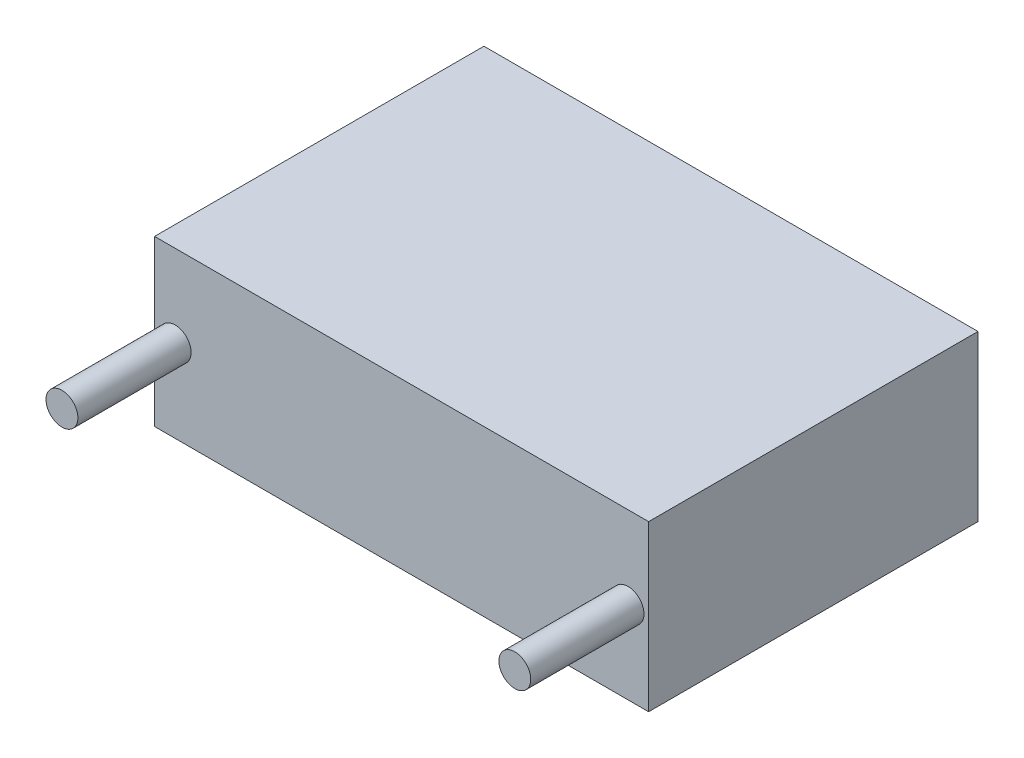
ISO-10303-21;
HEADER;
FILE_DESCRIPTION(('STEP AP214'),'2;1');
FILE_NAME('part.step','',(''),(''),'','','');
FILE_SCHEMA(('AUTOMOTIVE_DESIGN { 1 0 10303 214 1 1 1 1 }'));
ENDSEC;
DATA;
#1=APPLICATION_CONTEXT('core data for automotive mechanical design processes');
#2=APPLICATION_PROTOCOL_DEFINITION('international standard','automotive_design',2000,#1);
#3=PRODUCT_CONTEXT('',#1,'mechanical');
#4=PRODUCT('Part','Part','',(#3));
#5=PRODUCT_RELATED_PRODUCT_CATEGORY('part','',(#4));
#6=PRODUCT_DEFINITION_FORMATION('','',#4);
#7=PRODUCT_DEFINITION_CONTEXT('part definition',#1,'design');
#8=PRODUCT_DEFINITION('design','',#6,#7);
#9=PRODUCT_DEFINITION_SHAPE('','',#8);
#10=(LENGTH_UNIT() NAMED_UNIT(*) SI_UNIT(.MILLI.,.METRE.));
#11=(NAMED_UNIT(*) PLANE_ANGLE_UNIT() SI_UNIT($,.RADIAN.));
#12=(NAMED_UNIT(*) SI_UNIT($,.STERADIAN.) SOLID_ANGLE_UNIT());
#13=UNCERTAINTY_MEASURE_WITH_UNIT(LENGTH_MEASURE(1.E-05),#10,'distance_accuracy_value','');
#14=(GEOMETRIC_REPRESENTATION_CONTEXT(3) GLOBAL_UNCERTAINTY_ASSIGNED_CONTEXT((#13)) GLOBAL_UNIT_ASSIGNED_CONTEXT((#10,
#11,#12)) REPRESENTATION_CONTEXT('',''));
#15=CARTESIAN_POINT('',(0.,0.,0.));
#16=DIRECTION('',(0.,0.,1.));
#17=DIRECTION('',(1.,0.,0.));
#18=AXIS2_PLACEMENT_3D('',#15,#16,#17);
#19=CARTESIAN_POINT('',(0.,8.00000000000001,16.));
#20=DIRECTION('',(0.,0.,-1.));
#21=DIRECTION('',(-0.999999999999998,0.,0.));
#22=AXIS2_PLACEMENT_3D('',#19,#20,#21);
#23=PLANE('',#22);
#24=CARTESIAN_POINT('',(1.,4.,16.));
#25=DIRECTION('',(0.,0.,-1.));
#26=DIRECTION('',(-0.999999999999998,0.,0.));
#27=AXIS2_PLACEMENT_3D('',#24,#25,#26);
#28=CIRCLE('',#27,0.774571480334662);
#29=CARTESIAN_POINT('',(0.22542851966534,4.,16.));
#30=VERTEX_POINT('',#29);
#31=EDGE_CURVE('E36',#30,#30,#28,.F.);
#32=ORIENTED_EDGE('',*,*,#31,.F.);
#33=EDGE_LOOP('',(#32));
#34=FACE_BOUND('',#33,.T.);
#35=DIRECTION('',(0.,-0.999999999999999,0.));
#36=VECTOR('',#35,1.);
#37=CARTESIAN_POINT('',(0.,0.,16.));
#38=LINE('',#37,#36);
#39=CARTESIAN_POINT('',(0.,8.00000000000001,16.));
#40=VERTEX_POINT('',#39);
#41=CARTESIAN_POINT('',(0.,0.,16.));
#42=VERTEX_POINT('',#41);
#43=EDGE_CURVE('E100',#40,#42,#38,.T.);
#44=ORIENTED_EDGE('',*,*,#43,.T.);
#45=DIRECTION('',(0.999999999999998,0.,0.));
#46=VECTOR('',#45,1.);
#47=CARTESIAN_POINT('',(0.,0.,16.));
#48=LINE('',#47,#46);
#49=CARTESIAN_POINT('',(24.,0.,16.));
#50=VERTEX_POINT('',#49);
#51=EDGE_CURVE('E83',#42,#50,#48,.T.);
#52=ORIENTED_EDGE('',*,*,#51,.T.);
#53=DIRECTION('',(0.,0.999999999999999,0.));
#54=VECTOR('',#53,1.);
#55=CARTESIAN_POINT('',(24.,0.,16.));
#56=LINE('',#55,#54);
#57=CARTESIAN_POINT('',(24.,8.00000000000001,16.));
#58=VERTEX_POINT('',#57);
#59=EDGE_CURVE('E48',#50,#58,#56,.T.);
#60=ORIENTED_EDGE('',*,*,#59,.T.);
#61=DIRECTION('',(-0.999999999999998,0.,0.));
#62=VECTOR('',#61,1.);
#63=CARTESIAN_POINT('',(0.,8.00000000000001,16.));
#64=LINE('',#63,#62);
#65=EDGE_CURVE('E43',#58,#40,#64,.T.);
#66=ORIENTED_EDGE('',*,*,#65,.T.);
#67=EDGE_LOOP('',(#44,#52,#60,#66));
#68=FACE_BOUND('',#67,.T.);
#69=CARTESIAN_POINT('',(23.,4.,16.));
#70=DIRECTION('',(0.,0.,-1.));
#71=DIRECTION('',(-0.999999999999998,0.,0.));
#72=AXIS2_PLACEMENT_3D('',#69,#70,#71);
#73=CIRCLE('',#72,0.774571480334662);
#74=CARTESIAN_POINT('',(22.2254285196653,4.,16.));
#75=VERTEX_POINT('',#74);
#76=EDGE_CURVE('E11',#75,#75,#73,.F.);
#77=ORIENTED_EDGE('',*,*,#76,.F.);
#78=EDGE_LOOP('',(#77));
#79=FACE_BOUND('',#78,.T.);
#80=ADVANCED_FACE('F28',(#34,#68,#79),#23,.F.);
#81=CARTESIAN_POINT('',(0.,0.,16.));
#82=DIRECTION('',(0.999999999999998,0.,0.));
#83=DIRECTION('',(0.,0.,-1.));
#84=AXIS2_PLACEMENT_3D('',#81,#82,#83);
#85=PLANE('',#84);
#86=DIRECTION('',(0.,-0.999999999999999,0.));
#87=VECTOR('',#86,1.);
#88=CARTESIAN_POINT('',(0.,0.,0.));
#89=LINE('',#88,#87);
#90=CARTESIAN_POINT('',(0.,8.00000000000001,0.));
#91=VERTEX_POINT('',#90);
#92=CARTESIAN_POINT('',(0.,0.,0.));
#93=VERTEX_POINT('',#92);
#94=EDGE_CURVE('E74',#91,#93,#89,.T.);
#95=ORIENTED_EDGE('',*,*,#94,.T.);
#96=DIRECTION('',(0.,0.,-1.));
#97=VECTOR('',#96,1.);
#98=CARTESIAN_POINT('',(0.,0.,16.));
#99=LINE('',#98,#97);
#100=EDGE_CURVE('E81',#42,#93,#99,.T.);
#101=ORIENTED_EDGE('',*,*,#100,.F.);
#102=ORIENTED_EDGE('',*,*,#43,.F.);
#103=DIRECTION('',(0.,0.,-1.));
#104=VECTOR('',#103,1.);
#105=CARTESIAN_POINT('',(0.,8.00000000000001,16.));
#106=LINE('',#105,#104);
#107=EDGE_CURVE('E89',#40,#91,#106,.T.);
#108=ORIENTED_EDGE('',*,*,#107,.T.);
#109=EDGE_LOOP('',(#95,#101,#102,#108));
#110=FACE_BOUND('',#109,.T.);
#111=ADVANCED_FACE('F30',(#110),#85,.F.);
#112=CARTESIAN_POINT('',(0.,0.,16.));
#113=DIRECTION('',(0.,0.999999999999999,0.));
#114=DIRECTION('',(0.,0.,1.));
#115=AXIS2_PLACEMENT_3D('',#112,#113,#114);
#116=PLANE('',#115);
#117=DIRECTION('',(0.999999999999998,0.,0.));
#118=VECTOR('',#117,1.);
#119=CARTESIAN_POINT('',(0.,0.,0.));
#120=LINE('',#119,#118);
#121=CARTESIAN_POINT('',(24.,0.,0.));
#122=VERTEX_POINT('',#121);
#123=EDGE_CURVE('E69',#93,#122,#120,.T.);
#124=ORIENTED_EDGE('',*,*,#123,.T.);
#125=DIRECTION('',(0.,0.,-1.));
#126=VECTOR('',#125,1.);
#127=CARTESIAN_POINT('',(24.,0.,16.));
#128=LINE('',#127,#126);
#129=EDGE_CURVE('E86',#50,#122,#128,.T.);
#130=ORIENTED_EDGE('',*,*,#129,.F.);
#131=ORIENTED_EDGE('',*,*,#51,.F.);
#132=ORIENTED_EDGE('',*,*,#100,.T.);
#133=EDGE_LOOP('',(#124,#130,#131,#132));
#134=FACE_BOUND('',#133,.T.);
#135=ADVANCED_FACE('F82',(#134),#116,.F.);
#136=CARTESIAN_POINT('',(24.,0.,16.));
#137=DIRECTION('',(-0.999999999999998,0.,0.));
#138=DIRECTION('',(0.,0.,1.));
#139=AXIS2_PLACEMENT_3D('',#136,#137,#138);
#140=PLANE('',#139);
#141=DIRECTION('',(0.,0.999999999999999,0.));
#142=VECTOR('',#141,1.);
#143=CARTESIAN_POINT('',(24.,0.,0.));
#144=LINE('',#143,#142);
#145=CARTESIAN_POINT('',(24.,8.00000000000001,0.));
#146=VERTEX_POINT('',#145);
#147=EDGE_CURVE('E75',#122,#146,#144,.T.);
#148=ORIENTED_EDGE('',*,*,#147,.T.);
#149=DIRECTION('',(0.,0.,-1.));
#150=VECTOR('',#149,1.);
#151=CARTESIAN_POINT('',(24.,8.00000000000001,16.));
#152=LINE('',#151,#150);
#153=EDGE_CURVE('E106',#58,#146,#152,.T.);
#154=ORIENTED_EDGE('',*,*,#153,.F.);
#155=ORIENTED_EDGE('',*,*,#59,.F.);
#156=ORIENTED_EDGE('',*,*,#129,.T.);
#157=EDGE_LOOP('',(#148,#154,#155,#156));
#158=FACE_BOUND('',#157,.T.);
#159=ADVANCED_FACE('F143',(#158),#140,.F.);
#160=CARTESIAN_POINT('',(0.,8.00000000000001,16.));
#161=DIRECTION('',(0.,-0.999999999999999,0.));
#162=DIRECTION('',(0.,0.,-1.));
#163=AXIS2_PLACEMENT_3D('',#160,#161,#162);
#164=PLANE('',#163);
#165=DIRECTION('',(-0.999999999999998,0.,0.));
#166=VECTOR('',#165,1.);
#167=CARTESIAN_POINT('',(0.,8.00000000000001,0.));
#168=LINE('',#167,#166);
#169=EDGE_CURVE('E98',#146,#91,#168,.T.);
#170=ORIENTED_EDGE('',*,*,#169,.T.);
#171=ORIENTED_EDGE('',*,*,#107,.F.);
#172=ORIENTED_EDGE('',*,*,#65,.F.);
#173=ORIENTED_EDGE('',*,*,#153,.T.);
#174=EDGE_LOOP('',(#170,#171,#172,#173));
#175=FACE_BOUND('',#174,.T.);
#176=ADVANCED_FACE('F139',(#175),#164,.F.);
#177=CARTESIAN_POINT('',(0.,8.00000000000001,0.));
#178=DIRECTION('',(0.,0.,-1.));
#179=DIRECTION('',(-0.999999999999998,0.,0.));
#180=AXIS2_PLACEMENT_3D('',#177,#178,#179);
#181=PLANE('',#180);
#182=ORIENTED_EDGE('',*,*,#94,.F.);
#183=ORIENTED_EDGE('',*,*,#169,.F.);
#184=ORIENTED_EDGE('',*,*,#147,.F.);
#185=ORIENTED_EDGE('',*,*,#123,.F.);
#186=EDGE_LOOP('',(#182,#183,#184,#185));
#187=FACE_BOUND('',#186,.T.);
#188=ADVANCED_FACE('F71',(#187),#181,.T.);
#189=CARTESIAN_POINT('',(1.,4.,21.5));
#190=DIRECTION('',(0.,0.,-1.));
#191=DIRECTION('',(-0.999999999999998,0.,0.));
#192=AXIS2_PLACEMENT_3D('',#189,#190,#191);
#193=CYLINDRICAL_SURFACE('',#192,0.774571480334662);
#194=CARTESIAN_POINT('',(1.,4.,21.5));
#195=DIRECTION('',(0.,0.,1.));
#196=DIRECTION('',(0.999999999999998,0.,0.));
#197=AXIS2_PLACEMENT_3D('',#194,#195,#196);
#198=CIRCLE('',#197,0.774571480334662);
#199=CARTESIAN_POINT('',(0.22542851966534,4.,21.5));
#200=VERTEX_POINT('',#199);
#201=EDGE_CURVE('E90',#200,#200,#198,.T.);
#202=CARTESIAN_POINT('',(0.22542851966534,4.,21.5));
#203=CARTESIAN_POINT('',(0.22542851966534,4.,21.4427083333333));
#204=CARTESIAN_POINT('',(0.22542851966534,4.,21.3854166666667));
#205=CARTESIAN_POINT('',(0.22542851966534,4.,21.2708333333333));
#206=CARTESIAN_POINT('',(0.22542851966534,4.,21.2135416666667));
#207=CARTESIAN_POINT('',(0.22542851966534,4.,21.0989583333333));
#208=CARTESIAN_POINT('',(0.22542851966534,4.,21.0416666666667));
#209=CARTESIAN_POINT('',(0.22542851966534,4.,20.9270833333333));
#210=CARTESIAN_POINT('',(0.22542851966534,4.,20.8697916666667));
#211=CARTESIAN_POINT('',(0.22542851966534,4.,20.7552083333333));
#212=CARTESIAN_POINT('',(0.22542851966534,4.,20.6979166666667));
#213=CARTESIAN_POINT('',(0.22542851966534,4.,20.5833333333333));
#214=CARTESIAN_POINT('',(0.22542851966534,4.,20.5260416666667));
#215=CARTESIAN_POINT('',(0.22542851966534,4.,20.4114583333333));
#216=CARTESIAN_POINT('',(0.22542851966534,4.,20.3541666666667));
#217=CARTESIAN_POINT('',(0.22542851966534,4.,20.2395833333333));
#218=CARTESIAN_POINT('',(0.22542851966534,4.,20.1822916666667));
#219=CARTESIAN_POINT('',(0.22542851966534,4.,20.0677083333333));
#220=CARTESIAN_POINT('',(0.22542851966534,4.,20.0104166666667));
#221=CARTESIAN_POINT('',(0.22542851966534,4.,19.8958333333333));
#222=CARTESIAN_POINT('',(0.22542851966534,4.,19.8385416666667));
#223=CARTESIAN_POINT('',(0.22542851966534,4.,19.7239583333333));
#224=CARTESIAN_POINT('',(0.22542851966534,4.,19.6666666666667));
#225=CARTESIAN_POINT('',(0.22542851966534,4.,19.5520833333333));
#226=CARTESIAN_POINT('',(0.22542851966534,4.,19.4947916666667));
#227=CARTESIAN_POINT('',(0.22542851966534,4.,19.3802083333333));
#228=CARTESIAN_POINT('',(0.22542851966534,4.,19.3229166666667));
#229=CARTESIAN_POINT('',(0.22542851966534,4.,19.2083333333333));
#230=CARTESIAN_POINT('',(0.22542851966534,4.,19.1510416666667));
#231=CARTESIAN_POINT('',(0.22542851966534,4.,19.0364583333333));
#232=CARTESIAN_POINT('',(0.22542851966534,4.,18.9791666666667));
#233=CARTESIAN_POINT('',(0.22542851966534,4.,18.8645833333333));
#234=CARTESIAN_POINT('',(0.22542851966534,4.,18.8072916666667));
#235=CARTESIAN_POINT('',(0.22542851966534,4.,18.6927083333333));
#236=CARTESIAN_POINT('',(0.22542851966534,4.,18.6354166666667));
#237=CARTESIAN_POINT('',(0.22542851966534,4.,18.5208333333333));
#238=CARTESIAN_POINT('',(0.22542851966534,4.,18.4635416666667));
#239=CARTESIAN_POINT('',(0.22542851966534,4.,18.3489583333333));
#240=CARTESIAN_POINT('',(0.22542851966534,4.,18.2916666666667));
#241=CARTESIAN_POINT('',(0.22542851966534,4.,18.1770833333333));
#242=CARTESIAN_POINT('',(0.22542851966534,4.,18.1197916666667));
#243=CARTESIAN_POINT('',(0.22542851966534,4.,18.0052083333333));
#244=CARTESIAN_POINT('',(0.22542851966534,4.,17.9479166666667));
#245=CARTESIAN_POINT('',(0.22542851966534,4.,17.8333333333333));
#246=CARTESIAN_POINT('',(0.22542851966534,4.,17.7760416666667));
#247=CARTESIAN_POINT('',(0.22542851966534,4.,17.6614583333333));
#248=CARTESIAN_POINT('',(0.22542851966534,4.,17.6041666666667));
#249=CARTESIAN_POINT('',(0.22542851966534,4.,17.4895833333333));
#250=CARTESIAN_POINT('',(0.22542851966534,4.,17.4322916666667));
#251=CARTESIAN_POINT('',(0.22542851966534,4.,17.3177083333333));
#252=CARTESIAN_POINT('',(0.22542851966534,4.,17.2604166666667));
#253=CARTESIAN_POINT('',(0.22542851966534,4.,17.1458333333333));
#254=CARTESIAN_POINT('',(0.22542851966534,4.,17.0885416666667));
#255=CARTESIAN_POINT('',(0.22542851966534,4.,16.9739583333333));
#256=CARTESIAN_POINT('',(0.22542851966534,4.,16.9166666666667));
#257=CARTESIAN_POINT('',(0.22542851966534,4.,16.8020833333333));
#258=CARTESIAN_POINT('',(0.22542851966534,4.,16.7447916666667));
#259=CARTESIAN_POINT('',(0.22542851966534,4.,16.6302083333333));
#260=CARTESIAN_POINT('',(0.22542851966534,4.,16.5729166666667));
#261=CARTESIAN_POINT('',(0.22542851966534,4.,16.4583333333333));
#262=CARTESIAN_POINT('',(0.22542851966534,4.,16.4010416666667));
#263=CARTESIAN_POINT('',(0.22542851966534,4.,16.2864583333333));
#264=CARTESIAN_POINT('',(0.22542851966534,4.,16.2291666666667));
#265=CARTESIAN_POINT('',(0.22542851966534,4.,16.1145833333333));
#266=CARTESIAN_POINT('',(0.22542851966534,4.,16.0572916666667));
#267=CARTESIAN_POINT('',(0.22542851966534,4.,16.));
#268=B_SPLINE_CURVE_WITH_KNOTS('',3,(#202,#203,#204,#205,#206,#207,#208,#209,#210,#211,#212,
#213,#214,#215,#216,#217,#218,#219,#220,#221,#222,#223,#224,#225,#226,#227,#228,#229,#230,#231,
#232,#233,#234,#235,#236,#237,#238,#239,#240,#241,#242,#243,#244,#245,#246,#247,#248,#249,#250,
#251,#252,#253,#254,#255,#256,#257,#258,#259,#260,#261,#262,#263,#264,#265,#266,#267),
.UNSPECIFIED.,.F.,.F.,(4,2,2,2,2,2,2,2,2,2,2,2,2,2,2,2,2,2,2,2,2,2,2,2,2,2,2,2,2,2,2,2,4),(0.,
0.171875000000002,0.34375,0.515625000000002,0.687500000000001,0.859374999999999,1.03125,
1.203125,1.375,1.546875,1.71875,1.890625,2.0625,2.234375,2.40625,2.578125,2.75,2.921875,3.09375,
3.265625,3.4375,3.609375,3.78125,3.95312499999999,4.125,4.296875,4.46875,4.640625,4.8125,
4.984375,5.15624999999999,5.328125,5.49999999999999),.UNSPECIFIED.);
#269=EDGE_CURVE('BSEAM112',#200,#30,#268,.T.);
#270=ORIENTED_EDGE('',*,*,#201,.F.);
#271=ORIENTED_EDGE('',*,*,#31,.T.);
#272=ORIENTED_EDGE('',*,*,#269,.T.);
#273=ORIENTED_EDGE('',*,*,#269,.F.);
#274=EDGE_LOOP('',(#270,#272,#271,#273));
#275=FACE_BOUND('',#274,.T.);
#276=ADVANCED_FACE('F112',(#275),#193,.T.);
#277=CARTESIAN_POINT('',(1.,4.,21.5));
#278=DIRECTION('',(0.,0.,1.));
#279=DIRECTION('',(0.999999999999998,0.,0.));
#280=AXIS2_PLACEMENT_3D('',#277,#278,#279);
#281=PLANE('',#280);
#282=ORIENTED_EDGE('',*,*,#201,.T.);
#283=EDGE_LOOP('',(#282));
#284=FACE_BOUND('',#283,.T.);
#285=ADVANCED_FACE('F122',(#284),#281,.T.);
#286=CARTESIAN_POINT('',(23.,4.,21.5));
#287=DIRECTION('',(0.,0.,-1.));
#288=DIRECTION('',(-0.999999999999998,0.,0.));
#289=AXIS2_PLACEMENT_3D('',#286,#287,#288);
#290=CYLINDRICAL_SURFACE('',#289,0.774571480334662);
#291=CARTESIAN_POINT('',(23.,4.,21.5));
#292=DIRECTION('',(0.,0.,1.));
#293=DIRECTION('',(0.999999999999998,0.,0.));
#294=AXIS2_PLACEMENT_3D('',#291,#292,#293);
#295=CIRCLE('',#294,0.774571480334662);
#296=CARTESIAN_POINT('',(22.2254285196653,4.,21.5));
#297=VERTEX_POINT('',#296);
#298=EDGE_CURVE('E93',#297,#297,#295,.T.);
#299=CARTESIAN_POINT('',(22.2254285196653,4.,21.5));
#300=CARTESIAN_POINT('',(22.2254285196653,4.,21.4427083333333));
#301=CARTESIAN_POINT('',(22.2254285196653,4.,21.3854166666667));
#302=CARTESIAN_POINT('',(22.2254285196653,4.,21.2708333333333));
#303=CARTESIAN_POINT('',(22.2254285196653,4.,21.2135416666667));
#304=CARTESIAN_POINT('',(22.2254285196653,4.,21.0989583333333));
#305=CARTESIAN_POINT('',(22.2254285196653,4.,21.0416666666667));
#306=CARTESIAN_POINT('',(22.2254285196653,4.,20.9270833333333));
#307=CARTESIAN_POINT('',(22.2254285196653,4.,20.8697916666667));
#308=CARTESIAN_POINT('',(22.2254285196653,4.,20.7552083333333));
#309=CARTESIAN_POINT('',(22.2254285196653,4.,20.6979166666667));
#310=CARTESIAN_POINT('',(22.2254285196653,4.,20.5833333333333));
#311=CARTESIAN_POINT('',(22.2254285196653,4.,20.5260416666667));
#312=CARTESIAN_POINT('',(22.2254285196653,4.,20.4114583333333));
#313=CARTESIAN_POINT('',(22.2254285196653,4.,20.3541666666667));
#314=CARTESIAN_POINT('',(22.2254285196653,4.,20.2395833333333));
#315=CARTESIAN_POINT('',(22.2254285196653,4.,20.1822916666667));
#316=CARTESIAN_POINT('',(22.2254285196653,4.,20.0677083333333));
#317=CARTESIAN_POINT('',(22.2254285196653,4.,20.0104166666667));
#318=CARTESIAN_POINT('',(22.2254285196653,4.,19.8958333333333));
#319=CARTESIAN_POINT('',(22.2254285196653,4.,19.8385416666667));
#320=CARTESIAN_POINT('',(22.2254285196653,4.,19.7239583333333));
#321=CARTESIAN_POINT('',(22.2254285196653,4.,19.6666666666667));
#322=CARTESIAN_POINT('',(22.2254285196653,4.,19.5520833333333));
#323=CARTESIAN_POINT('',(22.2254285196653,4.,19.4947916666667));
#324=CARTESIAN_POINT('',(22.2254285196653,4.,19.3802083333333));
#325=CARTESIAN_POINT('',(22.2254285196653,4.,19.3229166666667));
#326=CARTESIAN_POINT('',(22.2254285196653,4.,19.2083333333333));
#327=CARTESIAN_POINT('',(22.2254285196653,4.,19.1510416666667));
#328=CARTESIAN_POINT('',(22.2254285196653,4.,19.0364583333333));
#329=CARTESIAN_POINT('',(22.2254285196653,4.,18.9791666666667));
#330=CARTESIAN_POINT('',(22.2254285196653,4.,18.8645833333333));
#331=CARTESIAN_POINT('',(22.2254285196653,4.,18.8072916666667));
#332=CARTESIAN_POINT('',(22.2254285196653,4.,18.6927083333333));
#333=CARTESIAN_POINT('',(22.2254285196653,4.,18.6354166666667));
#334=CARTESIAN_POINT('',(22.2254285196653,4.,18.5208333333333));
#335=CARTESIAN_POINT('',(22.2254285196653,4.,18.4635416666667));
#336=CARTESIAN_POINT('',(22.2254285196653,4.,18.3489583333333));
#337=CARTESIAN_POINT('',(22.2254285196653,4.,18.2916666666667));
#338=CARTESIAN_POINT('',(22.2254285196653,4.,18.1770833333333));
#339=CARTESIAN_POINT('',(22.2254285196653,4.,18.1197916666667));
#340=CARTESIAN_POINT('',(22.2254285196653,4.,18.0052083333333));
#341=CARTESIAN_POINT('',(22.2254285196653,4.,17.9479166666667));
#342=CARTESIAN_POINT('',(22.2254285196653,4.,17.8333333333333));
#343=CARTESIAN_POINT('',(22.2254285196653,4.,17.7760416666667));
#344=CARTESIAN_POINT('',(22.2254285196653,4.,17.6614583333333));
#345=CARTESIAN_POINT('',(22.2254285196653,4.,17.6041666666667));
#346=CARTESIAN_POINT('',(22.2254285196653,4.,17.4895833333333));
#347=CARTESIAN_POINT('',(22.2254285196653,4.,17.4322916666667));
#348=CARTESIAN_POINT('',(22.2254285196653,4.,17.3177083333333));
#349=CARTESIAN_POINT('',(22.2254285196653,4.,17.2604166666667));
#350=CARTESIAN_POINT('',(22.2254285196653,4.,17.1458333333333));
#351=CARTESIAN_POINT('',(22.2254285196653,4.,17.0885416666667));
#352=CARTESIAN_POINT('',(22.2254285196653,4.,16.9739583333333));
#353=CARTESIAN_POINT('',(22.2254285196653,4.,16.9166666666667));
#354=CARTESIAN_POINT('',(22.2254285196653,4.,16.8020833333333));
#355=CARTESIAN_POINT('',(22.2254285196653,4.,16.7447916666667));
#356=CARTESIAN_POINT('',(22.2254285196653,4.,16.6302083333333));
#357=CARTESIAN_POINT('',(22.2254285196653,4.,16.5729166666667));
#358=CARTESIAN_POINT('',(22.2254285196653,4.,16.4583333333333));
#359=CARTESIAN_POINT('',(22.2254285196653,4.,16.4010416666667));
#360=CARTESIAN_POINT('',(22.2254285196653,4.,16.2864583333333));
#361=CARTESIAN_POINT('',(22.2254285196653,4.,16.2291666666667));
#362=CARTESIAN_POINT('',(22.2254285196653,4.,16.1145833333333));
#363=CARTESIAN_POINT('',(22.2254285196653,4.,16.0572916666667));
#364=CARTESIAN_POINT('',(22.2254285196653,4.,16.));
#365=B_SPLINE_CURVE_WITH_KNOTS('',3,(#299,#300,#301,#302,#303,#304,#305,#306,#307,#308,#309,
#310,#311,#312,#313,#314,#315,#316,#317,#318,#319,#320,#321,#322,#323,#324,#325,#326,#327,#328,
#329,#330,#331,#332,#333,#334,#335,#336,#337,#338,#339,#340,#341,#342,#343,#344,#345,#346,#347,
#348,#349,#350,#351,#352,#353,#354,#355,#356,#357,#358,#359,#360,#361,#362,#363,#364),
.UNSPECIFIED.,.F.,.F.,(4,2,2,2,2,2,2,2,2,2,2,2,2,2,2,2,2,2,2,2,2,2,2,2,2,2,2,2,2,2,2,2,4),(0.,
0.171875000000002,0.34375,0.515625000000002,0.687500000000001,0.859374999999999,1.03125,
1.203125,1.375,1.546875,1.71875,1.890625,2.0625,2.234375,2.40625,2.578125,2.75,2.921875,3.09375,
3.265625,3.4375,3.609375,3.78125,3.95312499999999,4.125,4.296875,4.46875,4.640625,4.8125,
4.984375,5.15624999999999,5.328125,5.49999999999999),.UNSPECIFIED.);
#366=EDGE_CURVE('BSEAM119',#297,#75,#365,.T.);
#367=ORIENTED_EDGE('',*,*,#298,.F.);
#368=ORIENTED_EDGE('',*,*,#76,.T.);
#369=ORIENTED_EDGE('',*,*,#366,.T.);
#370=ORIENTED_EDGE('',*,*,#366,.F.);
#371=EDGE_LOOP('',(#367,#369,#368,#370));
#372=FACE_BOUND('',#371,.T.);
#373=ADVANCED_FACE('F119',(#372),#290,.T.);
#374=CARTESIAN_POINT('',(23.,4.,21.5));
#375=DIRECTION('',(0.,0.,1.));
#376=DIRECTION('',(0.999999999999998,0.,0.));
#377=AXIS2_PLACEMENT_3D('',#374,#375,#376);
#378=PLANE('',#377);
#379=ORIENTED_EDGE('',*,*,#298,.T.);
#380=EDGE_LOOP('',(#379));
#381=FACE_BOUND('',#380,.T.);
#382=ADVANCED_FACE('F121',(#381),#378,.T.);
#383=CLOSED_SHELL('',(#80,#111,#135,#159,#176,#188,#276,#285,#373,#382));
#384=MANIFOLD_SOLID_BREP('B2',#383);
#385=ADVANCED_BREP_SHAPE_REPRESENTATION('',(#18,#384),#14);
#386=SHAPE_DEFINITION_REPRESENTATION(#9,#385);
ENDSEC;
END-ISO-10303-21;
